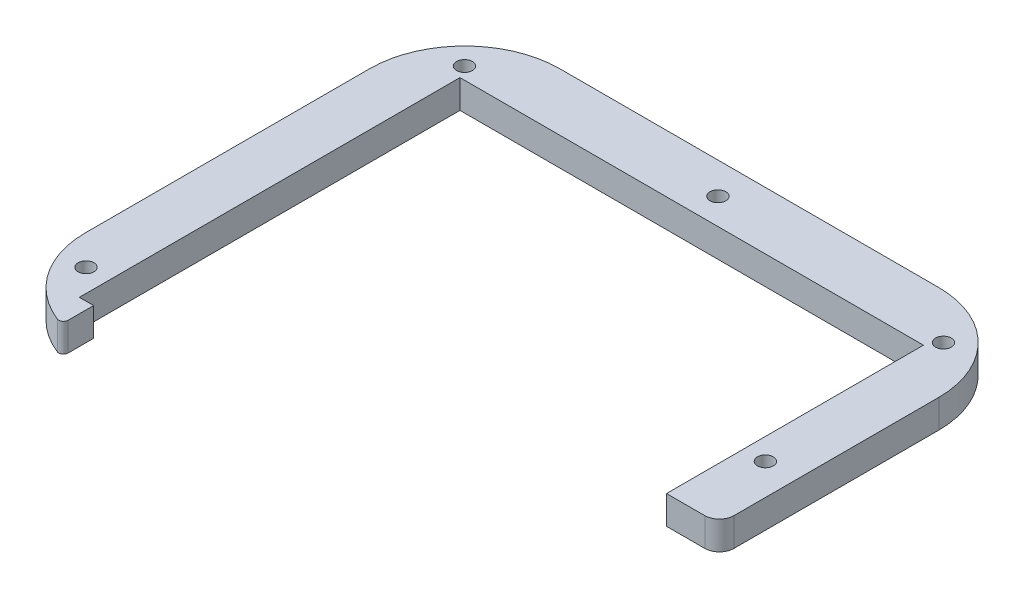
ISO-10303-21;
HEADER;
FILE_DESCRIPTION(('STEP AP214'),'2;1');
FILE_NAME('part.step','',(''),(''),'','','');
FILE_SCHEMA(('AUTOMOTIVE_DESIGN { 1 0 10303 214 1 1 1 1 }'));
ENDSEC;
DATA;
#1=APPLICATION_CONTEXT('core data for automotive mechanical design processes');
#2=APPLICATION_PROTOCOL_DEFINITION('international standard','automotive_design',2000,#1);
#3=PRODUCT_CONTEXT('',#1,'mechanical');
#4=PRODUCT('Part','Part','',(#3));
#5=PRODUCT_RELATED_PRODUCT_CATEGORY('part','',(#4));
#6=PRODUCT_DEFINITION_FORMATION('','',#4);
#7=PRODUCT_DEFINITION_CONTEXT('part definition',#1,'design');
#8=PRODUCT_DEFINITION('design','',#6,#7);
#9=PRODUCT_DEFINITION_SHAPE('','',#8);
#10=(LENGTH_UNIT() NAMED_UNIT(*) SI_UNIT(.MILLI.,.METRE.));
#11=(NAMED_UNIT(*) PLANE_ANGLE_UNIT() SI_UNIT($,.RADIAN.));
#12=(NAMED_UNIT(*) SI_UNIT($,.STERADIAN.) SOLID_ANGLE_UNIT());
#13=UNCERTAINTY_MEASURE_WITH_UNIT(LENGTH_MEASURE(1.E-05),#10,'distance_accuracy_value','');
#14=(GEOMETRIC_REPRESENTATION_CONTEXT(3) GLOBAL_UNCERTAINTY_ASSIGNED_CONTEXT((#13)) GLOBAL_UNIT_ASSIGNED_CONTEXT((#10,
#11,#12)) REPRESENTATION_CONTEXT('',''));
#15=CARTESIAN_POINT('',(0.,0.,0.));
#16=DIRECTION('',(0.,0.,1.));
#17=DIRECTION('',(1.,0.,0.));
#18=AXIS2_PLACEMENT_3D('',#15,#16,#17);
#19=CARTESIAN_POINT('',(-40.,6.,-30.));
#20=DIRECTION('',(0.,-1.,0.));
#21=DIRECTION('',(0.,0.,-1.));
#22=AXIS2_PLACEMENT_3D('',#19,#20,#21);
#23=CYLINDRICAL_SURFACE('',#22,20.08);
#24=CARTESIAN_POINT('',(-40.,0.,-30.));
#25=DIRECTION('',(0.,1.,0.));
#26=DIRECTION('',(0.,0.,1.));
#27=AXIS2_PLACEMENT_3D('',#24,#25,#26);
#28=CIRCLE('',#27,20.08);
#29=CARTESIAN_POINT('',(-40.,0.,-50.08));
#30=VERTEX_POINT('',#29);
#31=CARTESIAN_POINT('',(-60.08,0.,-30.));
#32=VERTEX_POINT('',#31);
#33=EDGE_CURVE('E144',#30,#32,#28,.T.);
#34=ORIENTED_EDGE('',*,*,#33,.T.);
#35=DIRECTION('',(0.,1.,0.));
#36=VECTOR('',#35,1.);
#37=CARTESIAN_POINT('',(-60.08,6.,-30.));
#38=LINE('',#37,#36);
#39=CARTESIAN_POINT('',(-60.08,6.,-30.));
#40=VERTEX_POINT('',#39);
#41=EDGE_CURVE('E216',#40,#32,#38,.F.);
#42=ORIENTED_EDGE('',*,*,#41,.F.);
#43=CARTESIAN_POINT('',(-40.,6.,-30.));
#44=DIRECTION('',(0.,1.,0.));
#45=DIRECTION('',(0.,0.,1.));
#46=AXIS2_PLACEMENT_3D('',#43,#44,#45);
#47=CIRCLE('',#46,20.08);
#48=CARTESIAN_POINT('',(-40.,6.,-50.08));
#49=VERTEX_POINT('',#48);
#50=EDGE_CURVE('E183',#49,#40,#47,.T.);
#51=ORIENTED_EDGE('',*,*,#50,.F.);
#52=DIRECTION('',(0.,-1.,0.));
#53=VECTOR('',#52,1.);
#54=CARTESIAN_POINT('',(-40.,6.,-50.08));
#55=LINE('',#54,#53);
#56=EDGE_CURVE('E182',#49,#30,#55,.T.);
#57=ORIENTED_EDGE('',*,*,#56,.T.);
#58=EDGE_LOOP('',(#34,#42,#51,#57));
#59=FACE_BOUND('',#58,.T.);
#60=ADVANCED_FACE('F33',(#59),#23,.T.);
#61=CARTESIAN_POINT('',(-60.08,6.,-30.));
#62=DIRECTION('',(1.,0.,0.));
#63=DIRECTION('',(0.,0.,-1.));
#64=AXIS2_PLACEMENT_3D('',#61,#62,#63);
#65=PLANE('',#64);
#66=DIRECTION('',(0.,0.,1.));
#67=VECTOR('',#66,1.);
#68=CARTESIAN_POINT('',(-60.08,0.,-30.));
#69=LINE('',#68,#67);
#70=CARTESIAN_POINT('',(-60.08,0.,30.));
#71=VERTEX_POINT('',#70);
#72=EDGE_CURVE('E202',#32,#71,#69,.T.);
#73=ORIENTED_EDGE('',*,*,#72,.T.);
#74=DIRECTION('',(0.,-1.,0.));
#75=VECTOR('',#74,1.);
#76=CARTESIAN_POINT('',(-60.08,6.,30.));
#77=LINE('',#76,#75);
#78=CARTESIAN_POINT('',(-60.08,6.,30.));
#79=VERTEX_POINT('',#78);
#80=EDGE_CURVE('E263',#79,#71,#77,.T.);
#81=ORIENTED_EDGE('',*,*,#80,.F.);
#82=DIRECTION('',(0.,0.,1.));
#83=VECTOR('',#82,1.);
#84=CARTESIAN_POINT('',(-60.08,6.,-30.));
#85=LINE('',#84,#83);
#86=EDGE_CURVE('E186',#40,#79,#85,.T.);
#87=ORIENTED_EDGE('',*,*,#86,.F.);
#88=ORIENTED_EDGE('',*,*,#41,.T.);
#89=EDGE_LOOP('',(#73,#81,#87,#88));
#90=FACE_BOUND('',#89,.T.);
#91=ADVANCED_FACE('F264',(#90),#65,.F.);
#92=CARTESIAN_POINT('',(-40.,6.,30.));
#93=DIRECTION('',(0.,-1.,0.));
#94=DIRECTION('',(0.,0.,-1.));
#95=AXIS2_PLACEMENT_3D('',#92,#93,#94);
#96=CYLINDRICAL_SURFACE('',#95,20.08);
#97=CARTESIAN_POINT('',(-40.,0.,30.));
#98=DIRECTION('',(0.,1.,0.));
#99=DIRECTION('',(0.,0.,1.));
#100=AXIS2_PLACEMENT_3D('',#97,#98,#99);
#101=CIRCLE('',#100,20.08);
#102=CARTESIAN_POINT('',(-47.2826834381551,0.,48.7128010180096));
#103=VERTEX_POINT('',#102);
#104=EDGE_CURVE('E198',#71,#103,#101,.T.);
#105=ORIENTED_EDGE('',*,*,#104,.T.);
#106=DIRECTION('',(0.,-1.,0.));
#107=VECTOR('',#106,1.);
#108=CARTESIAN_POINT('',(-47.2826834381551,6.,48.7128010180096));
#109=LINE('',#108,#107);
#110=CARTESIAN_POINT('',(-47.2826834381551,6.,48.7128010180096));
#111=VERTEX_POINT('',#110);
#112=EDGE_CURVE('E173',#103,#111,#109,.F.);
#113=ORIENTED_EDGE('',*,*,#112,.T.);
#114=CARTESIAN_POINT('',(-40.,6.,30.));
#115=DIRECTION('',(0.,1.,0.));
#116=DIRECTION('',(0.,0.,1.));
#117=AXIS2_PLACEMENT_3D('',#114,#115,#116);
#118=CIRCLE('',#117,20.08);
#119=EDGE_CURVE('E178',#79,#111,#118,.T.);
#120=ORIENTED_EDGE('',*,*,#119,.F.);
#121=ORIENTED_EDGE('',*,*,#80,.T.);
#122=EDGE_LOOP('',(#105,#113,#120,#121));
#123=FACE_BOUND('',#122,.T.);
#124=ADVANCED_FACE('F253',(#123),#96,.T.);
#125=CARTESIAN_POINT('',(60.08,6.,-30.));
#126=DIRECTION('',(-1.,0.,0.));
#127=DIRECTION('',(0.,0.,1.));
#128=AXIS2_PLACEMENT_3D('',#125,#126,#127);
#129=PLANE('',#128);
#130=DIRECTION('',(0.,0.,-1.));
#131=VECTOR('',#130,1.);
#132=CARTESIAN_POINT('',(60.08,6.,-30.));
#133=LINE('',#132,#131);
#134=CARTESIAN_POINT('',(60.08,6.,13.24));
#135=VERTEX_POINT('',#134);
#136=CARTESIAN_POINT('',(60.08,6.,-30.));
#137=VERTEX_POINT('',#136);
#138=EDGE_CURVE('E175',#135,#137,#133,.T.);
#139=ORIENTED_EDGE('',*,*,#138,.F.);
#140=DIRECTION('',(0.,1.,0.));
#141=VECTOR('',#140,1.);
#142=CARTESIAN_POINT('',(60.08,6.,13.24));
#143=LINE('',#142,#141);
#144=CARTESIAN_POINT('',(60.08,0.,13.24));
#145=VERTEX_POINT('',#144);
#146=EDGE_CURVE('E212',#135,#145,#143,.F.);
#147=ORIENTED_EDGE('',*,*,#146,.T.);
#148=DIRECTION('',(0.,0.,-1.));
#149=VECTOR('',#148,1.);
#150=CARTESIAN_POINT('',(60.08,0.,-30.));
#151=LINE('',#150,#149);
#152=CARTESIAN_POINT('',(60.08,0.,-30.));
#153=VERTEX_POINT('',#152);
#154=EDGE_CURVE('E201',#145,#153,#151,.T.);
#155=ORIENTED_EDGE('',*,*,#154,.T.);
#156=DIRECTION('',(0.,-1.,0.));
#157=VECTOR('',#156,1.);
#158=CARTESIAN_POINT('',(60.08,6.,-30.));
#159=LINE('',#158,#157);
#160=EDGE_CURVE('E265',#137,#153,#159,.T.);
#161=ORIENTED_EDGE('',*,*,#160,.F.);
#162=EDGE_LOOP('',(#139,#147,#155,#161));
#163=FACE_BOUND('',#162,.T.);
#164=ADVANCED_FACE('F293',(#163),#129,.F.);
#165=CARTESIAN_POINT('',(40.,6.,-30.));
#166=DIRECTION('',(0.,-1.,0.));
#167=DIRECTION('',(0.,0.,-1.));
#168=AXIS2_PLACEMENT_3D('',#165,#166,#167);
#169=CYLINDRICAL_SURFACE('',#168,20.08);
#170=CARTESIAN_POINT('',(40.,0.,-30.));
#171=DIRECTION('',(0.,1.,0.));
#172=DIRECTION('',(0.,0.,1.));
#173=AXIS2_PLACEMENT_3D('',#170,#171,#172);
#174=CIRCLE('',#173,20.08);
#175=CARTESIAN_POINT('',(40.,0.,-50.08));
#176=VERTEX_POINT('',#175);
#177=EDGE_CURVE('E207',#153,#176,#174,.T.);
#178=ORIENTED_EDGE('',*,*,#177,.T.);
#179=DIRECTION('',(0.,1.,0.));
#180=VECTOR('',#179,1.);
#181=CARTESIAN_POINT('',(40.,6.,-50.08));
#182=LINE('',#181,#180);
#183=CARTESIAN_POINT('',(40.,6.,-50.08));
#184=VERTEX_POINT('',#183);
#185=EDGE_CURVE('E269',#184,#176,#182,.F.);
#186=ORIENTED_EDGE('',*,*,#185,.F.);
#187=CARTESIAN_POINT('',(40.,6.,-30.));
#188=DIRECTION('',(0.,1.,0.));
#189=DIRECTION('',(0.,0.,1.));
#190=AXIS2_PLACEMENT_3D('',#187,#188,#189);
#191=CIRCLE('',#190,20.08);
#192=EDGE_CURVE('E177',#137,#184,#191,.T.);
#193=ORIENTED_EDGE('',*,*,#192,.F.);
#194=ORIENTED_EDGE('',*,*,#160,.T.);
#195=EDGE_LOOP('',(#178,#186,#193,#194));
#196=FACE_BOUND('',#195,.T.);
#197=ADVANCED_FACE('F302',(#196),#169,.T.);
#198=CARTESIAN_POINT('',(-40.,6.,-50.08));
#199=DIRECTION('',(0.,0.,1.));
#200=DIRECTION('',(1.,0.,0.));
#201=AXIS2_PLACEMENT_3D('',#198,#199,#200);
#202=PLANE('',#201);
#203=DIRECTION('',(-1.,0.,0.));
#204=VECTOR('',#203,1.);
#205=CARTESIAN_POINT('',(-40.,0.,-50.08));
#206=LINE('',#205,#204);
#207=EDGE_CURVE('E187',#176,#30,#206,.T.);
#208=ORIENTED_EDGE('',*,*,#207,.T.);
#209=ORIENTED_EDGE('',*,*,#56,.F.);
#210=DIRECTION('',(-1.,0.,0.));
#211=VECTOR('',#210,1.);
#212=CARTESIAN_POINT('',(-40.,6.,-50.08));
#213=LINE('',#212,#211);
#214=EDGE_CURVE('E180',#184,#49,#213,.T.);
#215=ORIENTED_EDGE('',*,*,#214,.F.);
#216=ORIENTED_EDGE('',*,*,#185,.T.);
#217=EDGE_LOOP('',(#208,#209,#215,#216));
#218=FACE_BOUND('',#217,.T.);
#219=ADVANCED_FACE('F306',(#218),#202,.F.);
#220=CARTESIAN_POINT('',(-40.,6.,-30.));
#221=DIRECTION('',(0.,1.,0.));
#222=DIRECTION('',(0.,0.,1.));
#223=AXIS2_PLACEMENT_3D('',#220,#221,#222);
#224=PLANE('',#223);
#225=CARTESIAN_POINT('',(-53.7092926056019,6.,36.2273752960606));
#226=DIRECTION('',(0.,1.,0.));
#227=DIRECTION('',(0.,0.,1.));
#228=AXIS2_PLACEMENT_3D('',#225,#226,#227);
#229=CIRCLE('',#228,1.67000000000001);
#230=CARTESIAN_POINT('',(-53.7092926056019,6.,37.8973752960606));
#231=VERTEX_POINT('',#230);
#232=EDGE_CURVE('E245',#231,#231,#229,.T.);
#233=ORIENTED_EDGE('',*,*,#232,.F.);
#234=EDGE_LOOP('',(#233));
#235=FACE_BOUND('',#234,.T.);
#236=CARTESIAN_POINT('',(-50.5585567633134,6.,-40.5085567633135));
#237=DIRECTION('',(0.,1.,0.));
#238=DIRECTION('',(0.,0.,1.));
#239=AXIS2_PLACEMENT_3D('',#236,#237,#238);
#240=CIRCLE('',#239,1.67000000000001);
#241=CARTESIAN_POINT('',(-50.5585567633134,6.,-38.8385567633135));
#242=VERTEX_POINT('',#241);
#243=EDGE_CURVE('E239',#242,#242,#240,.T.);
#244=ORIENTED_EDGE('',*,*,#243,.F.);
#245=EDGE_LOOP('',(#244));
#246=FACE_BOUND('',#245,.T.);
#247=CARTESIAN_POINT('',(50.5585567633134,6.,-40.5085567633134));
#248=DIRECTION('',(0.,1.,0.));
#249=DIRECTION('',(0.,0.,1.));
#250=AXIS2_PLACEMENT_3D('',#247,#248,#249);
#251=CIRCLE('',#250,1.67);
#252=CARTESIAN_POINT('',(50.5585567633134,6.,-38.8385567633134));
#253=VERTEX_POINT('',#252);
#254=EDGE_CURVE('E233',#253,#253,#251,.T.);
#255=ORIENTED_EDGE('',*,*,#254,.F.);
#256=EDGE_LOOP('',(#255));
#257=FACE_BOUND('',#256,.T.);
#258=CARTESIAN_POINT('',(0.,6.,-43.45));
#259=DIRECTION('',(0.,1.,0.));
#260=DIRECTION('',(0.,0.,1.));
#261=AXIS2_PLACEMENT_3D('',#258,#259,#260);
#262=CIRCLE('',#261,1.67);
#263=CARTESIAN_POINT('',(0.,6.,-41.78));
#264=VERTEX_POINT('',#263);
#265=EDGE_CURVE('E227',#264,#264,#262,.T.);
#266=ORIENTED_EDGE('',*,*,#265,.F.);
#267=EDGE_LOOP('',(#266));
#268=FACE_BOUND('',#267,.T.);
#269=CARTESIAN_POINT('',(53.475,6.,0.));
#270=DIRECTION('',(0.,1.,0.));
#271=DIRECTION('',(0.,0.,1.));
#272=AXIS2_PLACEMENT_3D('',#269,#270,#271);
#273=CIRCLE('',#272,1.67);
#274=CARTESIAN_POINT('',(53.475,6.,1.67));
#275=VERTEX_POINT('',#274);
#276=EDGE_CURVE('E221',#275,#275,#273,.T.);
#277=ORIENTED_EDGE('',*,*,#276,.F.);
#278=EDGE_LOOP('',(#277));
#279=FACE_BOUND('',#278,.T.);
#280=ORIENTED_EDGE('',*,*,#119,.T.);
#281=CARTESIAN_POINT('',(-46.92,6.,47.7808886167143));
#282=DIRECTION('',(0.,1.,0.));
#283=DIRECTION('',(0.,0.,1.));
#284=AXIS2_PLACEMENT_3D('',#281,#282,#283);
#285=CIRCLE('',#284,1.);
#286=CARTESIAN_POINT('',(-45.92,6.,47.7808886167143));
#287=VERTEX_POINT('',#286);
#288=EDGE_CURVE('E55',#111,#287,#285,.T.);
#289=ORIENTED_EDGE('',*,*,#288,.T.);
#290=DIRECTION('',(0.,0.,1.));
#291=VECTOR('',#290,1.);
#292=CARTESIAN_POINT('',(-45.9200000000001,6.,-30.));
#293=LINE('',#292,#291);
#294=CARTESIAN_POINT('',(-45.92,6.,42.42));
#295=VERTEX_POINT('',#294);
#296=EDGE_CURVE('E160',#295,#287,#293,.T.);
#297=ORIENTED_EDGE('',*,*,#296,.F.);
#298=DIRECTION('',(1.,0.,0.));
#299=VECTOR('',#298,1.);
#300=CARTESIAN_POINT('',(-40.,6.,42.42));
#301=LINE('',#300,#299);
#302=CARTESIAN_POINT('',(-48.92,6.,42.42));
#303=VERTEX_POINT('',#302);
#304=EDGE_CURVE('E157',#303,#295,#301,.T.);
#305=ORIENTED_EDGE('',*,*,#304,.F.);
#306=DIRECTION('',(0.,0.,1.));
#307=VECTOR('',#306,1.);
#308=CARTESIAN_POINT('',(-48.92,6.,-30.));
#309=LINE('',#308,#307);
#310=CARTESIAN_POINT('',(-48.92,6.,-37.92));
#311=VERTEX_POINT('',#310);
#312=EDGE_CURVE('E137',#311,#303,#309,.T.);
#313=ORIENTED_EDGE('',*,*,#312,.F.);
#314=DIRECTION('',(-1.,0.,0.));
#315=VECTOR('',#314,1.);
#316=CARTESIAN_POINT('',(-40.,6.,-37.92));
#317=LINE('',#316,#315);
#318=CARTESIAN_POINT('',(48.92,6.,-37.92));
#319=VERTEX_POINT('',#318);
#320=EDGE_CURVE('E149',#319,#311,#317,.T.);
#321=ORIENTED_EDGE('',*,*,#320,.F.);
#322=DIRECTION('',(0.,0.,-1.));
#323=VECTOR('',#322,1.);
#324=CARTESIAN_POINT('',(48.92,6.,-30.));
#325=LINE('',#324,#323);
#326=CARTESIAN_POINT('',(48.92,6.,16.32));
#327=VERTEX_POINT('',#326);
#328=EDGE_CURVE('E153',#327,#319,#325,.T.);
#329=ORIENTED_EDGE('',*,*,#328,.F.);
#330=DIRECTION('',(-1.,0.,0.));
#331=VECTOR('',#330,1.);
#332=CARTESIAN_POINT('',(-40.,6.,16.32));
#333=LINE('',#332,#331);
#334=CARTESIAN_POINT('',(57.,6.,16.32));
#335=VERTEX_POINT('',#334);
#336=EDGE_CURVE('E168',#335,#327,#333,.T.);
#337=ORIENTED_EDGE('',*,*,#336,.F.);
#338=CARTESIAN_POINT('',(57.,6.,13.24));
#339=DIRECTION('',(0.,1.,0.));
#340=DIRECTION('',(0.,0.,1.));
#341=AXIS2_PLACEMENT_3D('',#338,#339,#340);
#342=CIRCLE('',#341,3.08);
#343=EDGE_CURVE('E171',#335,#135,#342,.T.);
#344=ORIENTED_EDGE('',*,*,#343,.T.);
#345=ORIENTED_EDGE('',*,*,#138,.T.);
#346=ORIENTED_EDGE('',*,*,#192,.T.);
#347=ORIENTED_EDGE('',*,*,#214,.T.);
#348=ORIENTED_EDGE('',*,*,#50,.T.);
#349=ORIENTED_EDGE('',*,*,#86,.T.);
#350=EDGE_LOOP('',(#280,#289,#297,#305,#313,#321,#329,#337,#344,#345,#346,#347,#348,#349));
#351=FACE_BOUND('',#350,.T.);
#352=ADVANCED_FACE('F155',(#235,#246,#257,#268,#279,#351),#224,.T.);
#353=CARTESIAN_POINT('',(-40.,0.,-30.));
#354=DIRECTION('',(0.,1.,0.));
#355=DIRECTION('',(0.,0.,1.));
#356=AXIS2_PLACEMENT_3D('',#353,#354,#355);
#357=PLANE('',#356);
#358=CARTESIAN_POINT('',(-53.7092926056019,0.,36.2273752960606));
#359=DIRECTION('',(0.,1.,0.));
#360=DIRECTION('',(0.,0.,1.));
#361=AXIS2_PLACEMENT_3D('',#358,#359,#360);
#362=CIRCLE('',#361,1.67000000000001);
#363=CARTESIAN_POINT('',(-53.7092926056019,0.,37.8973752960606));
#364=VERTEX_POINT('',#363);
#365=EDGE_CURVE('E242',#364,#364,#362,.T.);
#366=ORIENTED_EDGE('',*,*,#365,.T.);
#367=EDGE_LOOP('',(#366));
#368=FACE_BOUND('',#367,.T.);
#369=CARTESIAN_POINT('',(-50.5585567633134,0.,-40.5085567633135));
#370=DIRECTION('',(0.,1.,0.));
#371=DIRECTION('',(0.,0.,1.));
#372=AXIS2_PLACEMENT_3D('',#369,#370,#371);
#373=CIRCLE('',#372,1.67000000000001);
#374=CARTESIAN_POINT('',(-50.5585567633134,0.,-38.8385567633135));
#375=VERTEX_POINT('',#374);
#376=EDGE_CURVE('E236',#375,#375,#373,.T.);
#377=ORIENTED_EDGE('',*,*,#376,.T.);
#378=EDGE_LOOP('',(#377));
#379=FACE_BOUND('',#378,.T.);
#380=CARTESIAN_POINT('',(50.5585567633134,0.,-40.5085567633134));
#381=DIRECTION('',(0.,1.,0.));
#382=DIRECTION('',(0.,0.,1.));
#383=AXIS2_PLACEMENT_3D('',#380,#381,#382);
#384=CIRCLE('',#383,1.67);
#385=CARTESIAN_POINT('',(50.5585567633134,0.,-38.8385567633134));
#386=VERTEX_POINT('',#385);
#387=EDGE_CURVE('E230',#386,#386,#384,.T.);
#388=ORIENTED_EDGE('',*,*,#387,.T.);
#389=EDGE_LOOP('',(#388));
#390=FACE_BOUND('',#389,.T.);
#391=CARTESIAN_POINT('',(0.,0.,-43.45));
#392=DIRECTION('',(0.,1.,0.));
#393=DIRECTION('',(0.,0.,1.));
#394=AXIS2_PLACEMENT_3D('',#391,#392,#393);
#395=CIRCLE('',#394,1.67);
#396=CARTESIAN_POINT('',(0.,0.,-41.78));
#397=VERTEX_POINT('',#396);
#398=EDGE_CURVE('E224',#397,#397,#395,.T.);
#399=ORIENTED_EDGE('',*,*,#398,.T.);
#400=EDGE_LOOP('',(#399));
#401=FACE_BOUND('',#400,.T.);
#402=CARTESIAN_POINT('',(53.475,0.,0.));
#403=DIRECTION('',(0.,1.,0.));
#404=DIRECTION('',(0.,0.,1.));
#405=AXIS2_PLACEMENT_3D('',#402,#403,#404);
#406=CIRCLE('',#405,1.67);
#407=CARTESIAN_POINT('',(53.475,0.,1.67));
#408=VERTEX_POINT('',#407);
#409=EDGE_CURVE('E170',#408,#408,#406,.T.);
#410=ORIENTED_EDGE('',*,*,#409,.T.);
#411=EDGE_LOOP('',(#410));
#412=FACE_BOUND('',#411,.T.);
#413=DIRECTION('',(0.,0.,1.));
#414=VECTOR('',#413,1.);
#415=CARTESIAN_POINT('',(-45.9200000000001,0.,-30.));
#416=LINE('',#415,#414);
#417=CARTESIAN_POINT('',(-45.92,0.,42.42));
#418=VERTEX_POINT('',#417);
#419=CARTESIAN_POINT('',(-45.92,0.,47.7808886167143));
#420=VERTEX_POINT('',#419);
#421=EDGE_CURVE('E195',#418,#420,#416,.T.);
#422=ORIENTED_EDGE('',*,*,#421,.T.);
#423=CARTESIAN_POINT('',(-46.92,0.,47.7808886167143));
#424=DIRECTION('',(0.,1.,0.));
#425=DIRECTION('',(0.,0.,1.));
#426=AXIS2_PLACEMENT_3D('',#423,#424,#425);
#427=CIRCLE('',#426,1.);
#428=EDGE_CURVE('E12',#420,#103,#427,.F.);
#429=ORIENTED_EDGE('',*,*,#428,.T.);
#430=ORIENTED_EDGE('',*,*,#104,.F.);
#431=ORIENTED_EDGE('',*,*,#72,.F.);
#432=ORIENTED_EDGE('',*,*,#33,.F.);
#433=ORIENTED_EDGE('',*,*,#207,.F.);
#434=ORIENTED_EDGE('',*,*,#177,.F.);
#435=ORIENTED_EDGE('',*,*,#154,.F.);
#436=CARTESIAN_POINT('',(57.,0.,13.24));
#437=DIRECTION('',(0.,1.,0.));
#438=DIRECTION('',(0.,0.,1.));
#439=AXIS2_PLACEMENT_3D('',#436,#437,#438);
#440=CIRCLE('',#439,3.08);
#441=CARTESIAN_POINT('',(57.,0.,16.32));
#442=VERTEX_POINT('',#441);
#443=EDGE_CURVE('E210',#145,#442,#440,.F.);
#444=ORIENTED_EDGE('',*,*,#443,.T.);
#445=DIRECTION('',(-1.,0.,0.));
#446=VECTOR('',#445,1.);
#447=CARTESIAN_POINT('',(-40.,0.,16.32));
#448=LINE('',#447,#446);
#449=CARTESIAN_POINT('',(48.92,0.,16.32));
#450=VERTEX_POINT('',#449);
#451=EDGE_CURVE('E163',#442,#450,#448,.T.);
#452=ORIENTED_EDGE('',*,*,#451,.T.);
#453=DIRECTION('',(0.,0.,-1.));
#454=VECTOR('',#453,1.);
#455=CARTESIAN_POINT('',(48.92,0.,-30.));
#456=LINE('',#455,#454);
#457=CARTESIAN_POINT('',(48.92,0.,-37.92));
#458=VERTEX_POINT('',#457);
#459=EDGE_CURVE('E214',#450,#458,#456,.T.);
#460=ORIENTED_EDGE('',*,*,#459,.T.);
#461=DIRECTION('',(-1.,0.,0.));
#462=VECTOR('',#461,1.);
#463=CARTESIAN_POINT('',(-40.,0.,-37.92));
#464=LINE('',#463,#462);
#465=CARTESIAN_POINT('',(-48.92,0.,-37.92));
#466=VERTEX_POINT('',#465);
#467=EDGE_CURVE('E197',#458,#466,#464,.T.);
#468=ORIENTED_EDGE('',*,*,#467,.T.);
#469=DIRECTION('',(0.,0.,1.));
#470=VECTOR('',#469,1.);
#471=CARTESIAN_POINT('',(-48.92,0.,-30.));
#472=LINE('',#471,#470);
#473=CARTESIAN_POINT('',(-48.92,0.,42.42));
#474=VERTEX_POINT('',#473);
#475=EDGE_CURVE('E140',#466,#474,#472,.T.);
#476=ORIENTED_EDGE('',*,*,#475,.T.);
#477=DIRECTION('',(1.,0.,0.));
#478=VECTOR('',#477,1.);
#479=CARTESIAN_POINT('',(-40.,0.,42.42));
#480=LINE('',#479,#478);
#481=EDGE_CURVE('E192',#474,#418,#480,.T.);
#482=ORIENTED_EDGE('',*,*,#481,.T.);
#483=EDGE_LOOP('',(#422,#429,#430,#431,#432,#433,#434,#435,#444,#452,#460,#468,#476,#482));
#484=FACE_BOUND('',#483,.T.);
#485=ADVANCED_FACE('F297',(#368,#379,#390,#401,#412,#484),#357,.F.);
#486=CARTESIAN_POINT('',(48.92,0.,-38.));
#487=DIRECTION('',(1.,0.,0.));
#488=DIRECTION('',(0.,0.,-1.));
#489=AXIS2_PLACEMENT_3D('',#486,#487,#488);
#490=PLANE('',#489);
#491=ORIENTED_EDGE('',*,*,#459,.F.);
#492=DIRECTION('',(0.,1.,0.));
#493=VECTOR('',#492,1.);
#494=CARTESIAN_POINT('',(48.92,0.,16.32));
#495=LINE('',#494,#493);
#496=EDGE_CURVE('E158',#450,#327,#495,.T.);
#497=ORIENTED_EDGE('',*,*,#496,.T.);
#498=ORIENTED_EDGE('',*,*,#328,.T.);
#499=DIRECTION('',(0.,1.,0.));
#500=VECTOR('',#499,1.);
#501=CARTESIAN_POINT('',(48.92,0.,-37.92));
#502=LINE('',#501,#500);
#503=EDGE_CURVE('E145',#458,#319,#502,.T.);
#504=ORIENTED_EDGE('',*,*,#503,.F.);
#505=EDGE_LOOP('',(#491,#497,#498,#504));
#506=FACE_BOUND('',#505,.T.);
#507=ADVANCED_FACE('F356',(#506),#490,.F.);
#508=CARTESIAN_POINT('',(-45.92,0.,42.5));
#509=DIRECTION('',(-1.,0.,0.));
#510=DIRECTION('',(0.,0.,1.));
#511=AXIS2_PLACEMENT_3D('',#508,#509,#510);
#512=PLANE('',#511);
#513=ORIENTED_EDGE('',*,*,#296,.T.);
#514=DIRECTION('',(0.,-1.,0.));
#515=VECTOR('',#514,1.);
#516=CARTESIAN_POINT('',(-45.92,0.,47.7808886167143));
#517=LINE('',#516,#515);
#518=EDGE_CURVE('E41',#287,#420,#517,.T.);
#519=ORIENTED_EDGE('',*,*,#518,.T.);
#520=ORIENTED_EDGE('',*,*,#421,.F.);
#521=DIRECTION('',(0.,1.,0.));
#522=VECTOR('',#521,1.);
#523=CARTESIAN_POINT('',(-45.92,0.,42.42));
#524=LINE('',#523,#522);
#525=EDGE_CURVE('E272',#418,#295,#524,.T.);
#526=ORIENTED_EDGE('',*,*,#525,.T.);
#527=EDGE_LOOP('',(#513,#519,#520,#526));
#528=FACE_BOUND('',#527,.T.);
#529=ADVANCED_FACE('F364',(#528),#512,.F.);
#530=CARTESIAN_POINT('',(-48.92,0.,42.5));
#531=DIRECTION('',(-1.,0.,0.));
#532=DIRECTION('',(0.,0.,1.));
#533=AXIS2_PLACEMENT_3D('',#530,#531,#532);
#534=PLANE('',#533);
#535=ORIENTED_EDGE('',*,*,#312,.T.);
#536=DIRECTION('',(0.,1.,0.));
#537=VECTOR('',#536,1.);
#538=CARTESIAN_POINT('',(-48.92,0.,42.42));
#539=LINE('',#538,#537);
#540=EDGE_CURVE('E218',#474,#303,#539,.T.);
#541=ORIENTED_EDGE('',*,*,#540,.F.);
#542=ORIENTED_EDGE('',*,*,#475,.F.);
#543=DIRECTION('',(0.,1.,0.));
#544=VECTOR('',#543,1.);
#545=CARTESIAN_POINT('',(-48.92,0.,-37.92));
#546=LINE('',#545,#544);
#547=EDGE_CURVE('E133',#466,#311,#546,.T.);
#548=ORIENTED_EDGE('',*,*,#547,.T.);
#549=EDGE_LOOP('',(#535,#541,#542,#548));
#550=FACE_BOUND('',#549,.T.);
#551=ADVANCED_FACE('F135',(#550),#534,.F.);
#552=CARTESIAN_POINT('',(-49.,0.,-37.92));
#553=DIRECTION('',(0.,0.,-1.));
#554=DIRECTION('',(-1.,0.,0.));
#555=AXIS2_PLACEMENT_3D('',#552,#553,#554);
#556=PLANE('',#555);
#557=ORIENTED_EDGE('',*,*,#320,.T.);
#558=ORIENTED_EDGE('',*,*,#547,.F.);
#559=ORIENTED_EDGE('',*,*,#467,.F.);
#560=ORIENTED_EDGE('',*,*,#503,.T.);
#561=EDGE_LOOP('',(#557,#558,#559,#560));
#562=FACE_BOUND('',#561,.T.);
#563=ADVANCED_FACE('F150',(#562),#556,.F.);
#564=CARTESIAN_POINT('',(-49.,0.,42.42));
#565=DIRECTION('',(0.,0.,1.));
#566=DIRECTION('',(1.,0.,0.));
#567=AXIS2_PLACEMENT_3D('',#564,#565,#566);
#568=PLANE('',#567);
#569=ORIENTED_EDGE('',*,*,#304,.T.);
#570=ORIENTED_EDGE('',*,*,#525,.F.);
#571=ORIENTED_EDGE('',*,*,#481,.F.);
#572=ORIENTED_EDGE('',*,*,#540,.T.);
#573=EDGE_LOOP('',(#569,#570,#571,#572));
#574=FACE_BOUND('',#573,.T.);
#575=ADVANCED_FACE('F365',(#574),#568,.F.);
#576=CARTESIAN_POINT('',(49.,0.,16.32));
#577=DIRECTION('',(0.,0.,-1.));
#578=DIRECTION('',(-1.,0.,0.));
#579=AXIS2_PLACEMENT_3D('',#576,#577,#578);
#580=PLANE('',#579);
#581=ORIENTED_EDGE('',*,*,#451,.F.);
#582=DIRECTION('',(0.,1.,0.));
#583=VECTOR('',#582,1.);
#584=CARTESIAN_POINT('',(57.,0.,16.32));
#585=LINE('',#584,#583);
#586=EDGE_CURVE('E174',#442,#335,#585,.T.);
#587=ORIENTED_EDGE('',*,*,#586,.T.);
#588=ORIENTED_EDGE('',*,*,#336,.T.);
#589=ORIENTED_EDGE('',*,*,#496,.F.);
#590=EDGE_LOOP('',(#581,#587,#588,#589));
#591=FACE_BOUND('',#590,.T.);
#592=ADVANCED_FACE('F284',(#591),#580,.F.);
#593=CARTESIAN_POINT('',(57.,6.,13.24));
#594=DIRECTION('',(0.,-1.,0.));
#595=DIRECTION('',(0.,0.,-1.));
#596=AXIS2_PLACEMENT_3D('',#593,#594,#595);
#597=CYLINDRICAL_SURFACE('',#596,3.08);
#598=ORIENTED_EDGE('',*,*,#343,.F.);
#599=ORIENTED_EDGE('',*,*,#586,.F.);
#600=ORIENTED_EDGE('',*,*,#443,.F.);
#601=ORIENTED_EDGE('',*,*,#146,.F.);
#602=EDGE_LOOP('',(#598,#599,#600,#601));
#603=FACE_BOUND('',#602,.T.);
#604=ADVANCED_FACE('F290',(#603),#597,.T.);
#605=CARTESIAN_POINT('',(53.475,0.,0.));
#606=DIRECTION('',(0.,1.,0.));
#607=DIRECTION('',(0.,0.,1.));
#608=AXIS2_PLACEMENT_3D('',#605,#606,#607);
#609=CYLINDRICAL_SURFACE('',#608,1.67);
#610=ORIENTED_EDGE('',*,*,#409,.F.);
#611=EDGE_LOOP('',(#610));
#612=FACE_BOUND('',#611,.T.);
#613=ORIENTED_EDGE('',*,*,#276,.T.);
#614=EDGE_LOOP('',(#613));
#615=FACE_BOUND('',#614,.T.);
#616=ADVANCED_FACE('F337',(#612,#615),#609,.F.);
#617=CARTESIAN_POINT('',(0.,0.,-43.45));
#618=DIRECTION('',(0.,1.,0.));
#619=DIRECTION('',(0.,0.,1.));
#620=AXIS2_PLACEMENT_3D('',#617,#618,#619);
#621=CYLINDRICAL_SURFACE('',#620,1.67);
#622=ORIENTED_EDGE('',*,*,#398,.F.);
#623=EDGE_LOOP('',(#622));
#624=FACE_BOUND('',#623,.T.);
#625=ORIENTED_EDGE('',*,*,#265,.T.);
#626=EDGE_LOOP('',(#625));
#627=FACE_BOUND('',#626,.T.);
#628=ADVANCED_FACE('F334',(#624,#627),#621,.F.);
#629=CARTESIAN_POINT('',(50.5585567633134,0.,-40.5085567633134));
#630=DIRECTION('',(0.,1.,0.));
#631=DIRECTION('',(0.,0.,1.));
#632=AXIS2_PLACEMENT_3D('',#629,#630,#631);
#633=CYLINDRICAL_SURFACE('',#632,1.67);
#634=ORIENTED_EDGE('',*,*,#387,.F.);
#635=EDGE_LOOP('',(#634));
#636=FACE_BOUND('',#635,.T.);
#637=ORIENTED_EDGE('',*,*,#254,.T.);
#638=EDGE_LOOP('',(#637));
#639=FACE_BOUND('',#638,.T.);
#640=ADVANCED_FACE('F330',(#636,#639),#633,.F.);
#641=CARTESIAN_POINT('',(-50.5585567633134,0.,-40.5085567633135));
#642=DIRECTION('',(0.,1.,0.));
#643=DIRECTION('',(0.,0.,1.));
#644=AXIS2_PLACEMENT_3D('',#641,#642,#643);
#645=CYLINDRICAL_SURFACE('',#644,1.67000000000001);
#646=ORIENTED_EDGE('',*,*,#376,.F.);
#647=EDGE_LOOP('',(#646));
#648=FACE_BOUND('',#647,.T.);
#649=ORIENTED_EDGE('',*,*,#243,.T.);
#650=EDGE_LOOP('',(#649));
#651=FACE_BOUND('',#650,.T.);
#652=ADVANCED_FACE('F314',(#648,#651),#645,.F.);
#653=CARTESIAN_POINT('',(-53.7092926056019,0.,36.2273752960606));
#654=DIRECTION('',(0.,1.,0.));
#655=DIRECTION('',(0.,0.,1.));
#656=AXIS2_PLACEMENT_3D('',#653,#654,#655);
#657=CYLINDRICAL_SURFACE('',#656,1.67000000000001);
#658=ORIENTED_EDGE('',*,*,#365,.F.);
#659=EDGE_LOOP('',(#658));
#660=FACE_BOUND('',#659,.T.);
#661=ORIENTED_EDGE('',*,*,#232,.T.);
#662=EDGE_LOOP('',(#661));
#663=FACE_BOUND('',#662,.T.);
#664=ADVANCED_FACE('F310',(#660,#663),#657,.F.);
#665=CARTESIAN_POINT('',(-46.92,6.,47.7808886167143));
#666=DIRECTION('',(0.,-1.,0.));
#667=DIRECTION('',(0.,0.,-1.));
#668=AXIS2_PLACEMENT_3D('',#665,#666,#667);
#669=CYLINDRICAL_SURFACE('',#668,1.);
#670=ORIENTED_EDGE('',*,*,#428,.F.);
#671=ORIENTED_EDGE('',*,*,#518,.F.);
#672=ORIENTED_EDGE('',*,*,#288,.F.);
#673=ORIENTED_EDGE('',*,*,#112,.F.);
#674=EDGE_LOOP('',(#670,#671,#672,#673));
#675=FACE_BOUND('',#674,.T.);
#676=ADVANCED_FACE('F35',(#675),#669,.T.);
#677=CLOSED_SHELL('',(#60,#91,#124,#164,#197,#219,#352,#485,#507,#529,#551,#563,#575,#592,#604,
#616,#628,#640,#652,#664,#676));
#678=MANIFOLD_SOLID_BREP('B2',#677);
#679=ADVANCED_BREP_SHAPE_REPRESENTATION('',(#18,#678),#14);
#680=SHAPE_DEFINITION_REPRESENTATION(#9,#679);
ENDSEC;
END-ISO-10303-21;
